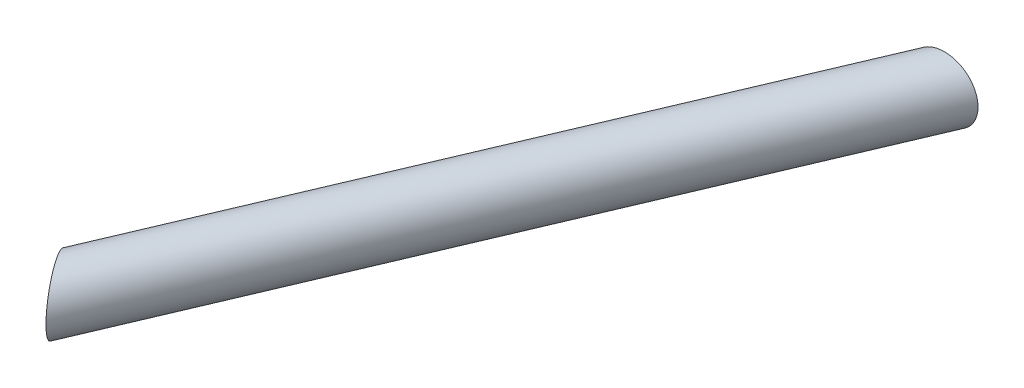
ISO-10303-21;
HEADER;
FILE_DESCRIPTION(('STEP AP214'),'2;1');
FILE_NAME('part.step','',(''),(''),'','','');
FILE_SCHEMA(('AUTOMOTIVE_DESIGN { 1 0 10303 214 1 1 1 1 }'));
ENDSEC;
DATA;
#1=APPLICATION_CONTEXT('core data for automotive mechanical design processes');
#2=APPLICATION_PROTOCOL_DEFINITION('international standard','automotive_design',2000,#1);
#3=PRODUCT_CONTEXT('',#1,'mechanical');
#4=PRODUCT('Part','Part','',(#3));
#5=PRODUCT_RELATED_PRODUCT_CATEGORY('part','',(#4));
#6=PRODUCT_DEFINITION_FORMATION('','',#4);
#7=PRODUCT_DEFINITION_CONTEXT('part definition',#1,'design');
#8=PRODUCT_DEFINITION('design','',#6,#7);
#9=PRODUCT_DEFINITION_SHAPE('','',#8);
#10=(LENGTH_UNIT() NAMED_UNIT(*) SI_UNIT(.MILLI.,.METRE.));
#11=(NAMED_UNIT(*) PLANE_ANGLE_UNIT() SI_UNIT($,.RADIAN.));
#12=(NAMED_UNIT(*) SI_UNIT($,.STERADIAN.) SOLID_ANGLE_UNIT());
#13=UNCERTAINTY_MEASURE_WITH_UNIT(LENGTH_MEASURE(1.E-05),#10,'distance_accuracy_value','');
#14=(GEOMETRIC_REPRESENTATION_CONTEXT(3) GLOBAL_UNCERTAINTY_ASSIGNED_CONTEXT((#13)) GLOBAL_UNIT_ASSIGNED_CONTEXT((#10,
#11,#12)) REPRESENTATION_CONTEXT('',''));
#15=CARTESIAN_POINT('',(0.,0.,0.));
#16=DIRECTION('',(0.,0.,1.));
#17=DIRECTION('',(1.,0.,0.));
#18=AXIS2_PLACEMENT_3D('',#15,#16,#17);
#19=CARTESIAN_POINT('',(65.,0.,0.));
#20=DIRECTION('',(0.391140640344852,0.,-0.920330918458475));
#21=DIRECTION('',(-0.920330918458475,0.,-0.391140640344852));
#22=AXIS2_PLACEMENT_3D('',#19,#20,#21);
#23=CYLINDRICAL_SURFACE('',#22,7.9);
#24=CARTESIAN_POINT('',(145.75,0.,-190.));
#25=DIRECTION('',(0.,0.,-1.));
#26=DIRECTION('',(1.,0.,0.));
#27=AXIS2_PLACEMENT_3D('',#24,#25,#26);
#28=ELLIPSE('',#27,8.58386895577979,7.9);
#29=CARTESIAN_POINT('',(147.029203505381,-7.81178513474894,-190.));
#30=VERTEX_POINT('',#29);
#31=CARTESIAN_POINT('',(151.992167087327,5.42278441710752,-190.));
#32=VERTEX_POINT('',#31);
#33=EDGE_CURVE('E57',#30,#32,#28,.T.);
#34=ORIENTED_EDGE('',*,*,#33,.T.);
#35=CARTESIAN_POINT('',(145.762937346756,0.,-190.030440815897));
#36=DIRECTION('',(0.00725504842418489,-0.00272064315906933,-0.999969980736004));
#37=DIRECTION('',(0.999952473211164,0.00653261113243015,0.00723714796509747));
#38=AXIS2_PLACEMENT_3D('',#35,#36,#37);
#39=ELLIPSE('',#38,8.55773895832352,7.9);
#40=EDGE_CURVE('E77',#32,#30,#39,.T.);
#41=ORIENTED_EDGE('',*,*,#40,.T.);
#42=EDGE_LOOP('',(#34,#41));
#43=FACE_BOUND('',#42,.T.);
#44=CARTESIAN_POINT('',(65.,0.,0.));
#45=DIRECTION('',(-0.834008585191079,0.,0.551751465632466));
#46=DIRECTION('',(-0.551751465632466,0.,-0.834008585191079));
#47=AXIS2_PLACEMENT_3D('',#44,#45,#46);
#48=ELLIPSE('',#47,9.47232455429705,7.9);
#49=CARTESIAN_POINT('',(59.7736310442203,0.,-7.89999999999997));
#50=VERTEX_POINT('',#49);
#51=EDGE_CURVE('E43',#50,#50,#48,.T.);
#52=ORIENTED_EDGE('',*,*,#51,.T.);
#53=EDGE_LOOP('',(#52));
#54=FACE_BOUND('',#53,.T.);
#55=ADVANCED_FACE('F39',(#43,#54),#23,.F.);
#56=CARTESIAN_POINT('',(65.,0.,0.));
#57=DIRECTION('',(0.391140640344852,0.,-0.920330918458475));
#58=DIRECTION('',(-0.920330918458475,0.,-0.391140640344852));
#59=AXIS2_PLACEMENT_3D('',#56,#57,#58);
#60=CYLINDRICAL_SURFACE('',#59,9.5);
#61=CARTESIAN_POINT('',(145.762937346756,0.,-190.030440815897));
#62=DIRECTION('',(0.00725504842418489,-0.00272064315906933,-0.999969980736004));
#63=DIRECTION('',(0.999952473211164,0.00653261113243015,0.00723714796509747));
#64=AXIS2_PLACEMENT_3D('',#61,#62,#63);
#65=ELLIPSE('',#64,10.290951911908,9.5);
#66=CARTESIAN_POINT('',(152.618106333548,7.09195574036234,-190.));
#67=VERTEX_POINT('',#66);
#68=CARTESIAN_POINT('',(146.40326425916,-9.48095645800376,-190.));
#69=VERTEX_POINT('',#68);
#70=EDGE_CURVE('E75',#67,#69,#65,.T.);
#71=ORIENTED_EDGE('',*,*,#70,.F.);
#72=CARTESIAN_POINT('',(145.75,0.,-190.));
#73=DIRECTION('',(0.,0.,-1.));
#74=DIRECTION('',(1.,0.,0.));
#75=AXIS2_PLACEMENT_3D('',#72,#73,#74);
#76=ELLIPSE('',#75,10.3223740607478,9.5);
#77=EDGE_CURVE('E66',#69,#67,#76,.T.);
#78=ORIENTED_EDGE('',*,*,#77,.F.);
#79=EDGE_LOOP('',(#71,#78));
#80=FACE_BOUND('',#79,.T.);
#81=CARTESIAN_POINT('',(65.,0.,0.));
#82=DIRECTION('',(-0.834008585191079,0.,0.551751465632466));
#83=DIRECTION('',(-0.551751465632466,0.,-0.834008585191079));
#84=AXIS2_PLACEMENT_3D('',#81,#82,#83);
#85=ELLIPSE('',#84,11.3907700336483,9.5);
#86=CARTESIAN_POINT('',(58.7151259392522,0.,-9.49999999999996));
#87=VERTEX_POINT('',#86);
#88=EDGE_CURVE('E11',#87,#87,#85,.T.);
#89=ORIENTED_EDGE('',*,*,#88,.F.);
#90=EDGE_LOOP('',(#89));
#91=FACE_BOUND('',#90,.T.);
#92=ADVANCED_FACE('F79',(#80,#91),#60,.T.);
#93=CARTESIAN_POINT('',(234.290460212321,196.51607742038,-189.922816241504));
#94=DIRECTION('',(0.00725504842418489,-0.00272064315906933,-0.999969980736004));
#95=DIRECTION('',(-0.999973681595049,0.,-0.00725507527490251));
#96=AXIS2_PLACEMENT_3D('',#93,#94,#95);
#97=PLANE('',#96);
#98=DIRECTION('',(-0.351123441588392,-0.936329177569045,0.));
#99=VECTOR('',#98,1.);
#100=CARTESIAN_POINT('',(146.676052980525,-8.75351986769697,-190.));
#101=LINE('',#100,#99);
#102=EDGE_CURVE('E49',#67,#32,#101,.T.);
#103=ORIENTED_EDGE('',*,*,#102,.F.);
#104=ORIENTED_EDGE('',*,*,#70,.T.);
#105=EDGE_CURVE('E63',#30,#69,#101,.T.);
#106=ORIENTED_EDGE('',*,*,#105,.F.);
#107=ORIENTED_EDGE('',*,*,#40,.F.);
#108=EDGE_LOOP('',(#103,#104,#106,#107));
#109=FACE_BOUND('',#108,.T.);
#110=ADVANCED_FACE('F74',(#109),#97,.T.);
#111=CARTESIAN_POINT('',(150.,-10.,-190.));
#112=DIRECTION('',(0.,0.,-1.));
#113=DIRECTION('',(-1.,0.,0.));
#114=AXIS2_PLACEMENT_3D('',#111,#112,#113);
#115=PLANE('',#114);
#116=ORIENTED_EDGE('',*,*,#105,.T.);
#117=ORIENTED_EDGE('',*,*,#77,.T.);
#118=ORIENTED_EDGE('',*,*,#102,.T.);
#119=ORIENTED_EDGE('',*,*,#33,.F.);
#120=EDGE_LOOP('',(#116,#117,#118,#119));
#121=FACE_BOUND('',#120,.T.);
#122=ADVANCED_FACE('F68',(#121),#115,.T.);
#123=CARTESIAN_POINT('',(65.,0.,0.));
#124=DIRECTION('',(-0.834008585191079,0.,0.551751465632466));
#125=DIRECTION('',(0.551751465632466,0.,0.834008585191079));
#126=AXIS2_PLACEMENT_3D('',#123,#124,#125);
#127=PLANE('',#126);
#128=ORIENTED_EDGE('',*,*,#51,.F.);
#129=EDGE_LOOP('',(#128));
#130=FACE_BOUND('',#129,.T.);
#131=ORIENTED_EDGE('',*,*,#88,.T.);
#132=EDGE_LOOP('',(#131));
#133=FACE_BOUND('',#132,.T.);
#134=ADVANCED_FACE('F41',(#130,#133),#127,.T.);
#135=CLOSED_SHELL('',(#55,#92,#110,#122,#134));
#136=MANIFOLD_SOLID_BREP('B2',#135);
#137=ADVANCED_BREP_SHAPE_REPRESENTATION('',(#18,#136),#14);
#138=SHAPE_DEFINITION_REPRESENTATION(#9,#137);
ENDSEC;
END-ISO-10303-21;
